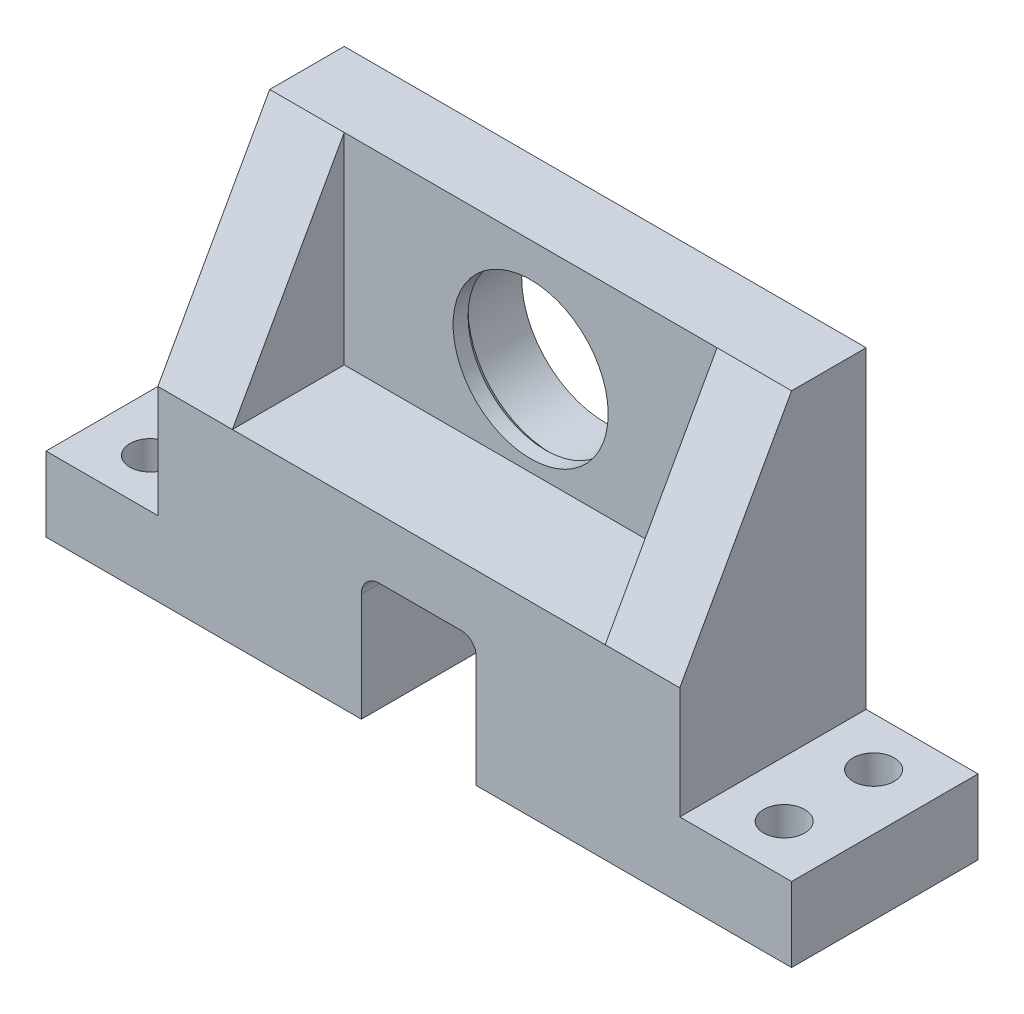
ISO-10303-21;
HEADER;
FILE_DESCRIPTION(('STEP AP214'),'2;1');
FILE_NAME('part.step','',(''),(''),'','','');
FILE_SCHEMA(('AUTOMOTIVE_DESIGN { 1 0 10303 214 1 1 1 1 }'));
ENDSEC;
DATA;
#1=APPLICATION_CONTEXT('core data for automotive mechanical design processes');
#2=APPLICATION_PROTOCOL_DEFINITION('international standard','automotive_design',2000,#1);
#3=PRODUCT_CONTEXT('',#1,'mechanical');
#4=PRODUCT('Part','Part','',(#3));
#5=PRODUCT_RELATED_PRODUCT_CATEGORY('part','',(#4));
#6=PRODUCT_DEFINITION_FORMATION('','',#4);
#7=PRODUCT_DEFINITION_CONTEXT('part definition',#1,'design');
#8=PRODUCT_DEFINITION('design','',#6,#7);
#9=PRODUCT_DEFINITION_SHAPE('','',#8);
#10=(LENGTH_UNIT() NAMED_UNIT(*) SI_UNIT(.MILLI.,.METRE.));
#11=(NAMED_UNIT(*) PLANE_ANGLE_UNIT() SI_UNIT($,.RADIAN.));
#12=(NAMED_UNIT(*) SI_UNIT($,.STERADIAN.) SOLID_ANGLE_UNIT());
#13=UNCERTAINTY_MEASURE_WITH_UNIT(LENGTH_MEASURE(1.E-05),#10,'distance_accuracy_value','');
#14=(GEOMETRIC_REPRESENTATION_CONTEXT(3) GLOBAL_UNCERTAINTY_ASSIGNED_CONTEXT((#13)) GLOBAL_UNIT_ASSIGNED_CONTEXT((#10,
#11,#12)) REPRESENTATION_CONTEXT('',''));
#15=CARTESIAN_POINT('',(0.,0.,0.));
#16=DIRECTION('',(0.,0.,1.));
#17=DIRECTION('',(1.,0.,0.));
#18=AXIS2_PLACEMENT_3D('',#15,#16,#17);
#19=CARTESIAN_POINT('',(0.,37.,25.));
#20=DIRECTION('',(0.,0.,-1.));
#21=DIRECTION('',(-1.,0.,0.));
#22=AXIS2_PLACEMENT_3D('',#19,#20,#21);
#23=CYLINDRICAL_SURFACE('',#22,11.2);
#24=CARTESIAN_POINT('',(0.,37.,7.20000000000002));
#25=DIRECTION('',(0.,0.,-1.));
#26=DIRECTION('',(-1.,0.,0.));
#27=AXIS2_PLACEMENT_3D('',#24,#25,#26);
#28=CIRCLE('',#27,11.2);
#29=CARTESIAN_POINT('',(-11.2,37.,7.20000000000002));
#30=VERTEX_POINT('',#29);
#31=EDGE_CURVE('E11',#30,#30,#28,.F.);
#32=ORIENTED_EDGE('',*,*,#31,.T.);
#33=EDGE_LOOP('',(#32));
#34=FACE_BOUND('',#33,.T.);
#35=CARTESIAN_POINT('',(0.,37.,0.));
#36=DIRECTION('',(0.,0.,-1.));
#37=DIRECTION('',(-1.,0.,0.));
#38=AXIS2_PLACEMENT_3D('',#35,#36,#37);
#39=CIRCLE('',#38,11.2);
#40=CARTESIAN_POINT('',(-11.2,37.,0.));
#41=VERTEX_POINT('',#40);
#42=EDGE_CURVE('E192',#41,#41,#39,.T.);
#43=ORIENTED_EDGE('',*,*,#42,.T.);
#44=EDGE_LOOP('',(#43));
#45=FACE_BOUND('',#44,.T.);
#46=ADVANCED_FACE('F39',(#34,#45),#23,.F.);
#47=CARTESIAN_POINT('',(-45.,25.,10.));
#48=DIRECTION('',(0.,-1.,0.));
#49=DIRECTION('',(0.,0.,-1.));
#50=AXIS2_PLACEMENT_3D('',#47,#48,#49);
#51=PLANE('',#50);
#52=DIRECTION('',(0.,0.,-1.));
#53=VECTOR('',#52,1.);
#54=CARTESIAN_POINT('',(25.,25.,10.));
#55=LINE('',#54,#53);
#56=CARTESIAN_POINT('',(25.,25.,25.));
#57=VERTEX_POINT('',#56);
#58=CARTESIAN_POINT('',(25.,25.,10.));
#59=VERTEX_POINT('',#58);
#60=EDGE_CURVE('E201',#57,#59,#55,.T.);
#61=ORIENTED_EDGE('',*,*,#60,.T.);
#62=DIRECTION('',(1.,0.,0.));
#63=VECTOR('',#62,1.);
#64=CARTESIAN_POINT('',(-45.,25.,10.));
#65=LINE('',#64,#63);
#66=CARTESIAN_POINT('',(-25.,25.,10.));
#67=VERTEX_POINT('',#66);
#68=EDGE_CURVE('E230',#67,#59,#65,.T.);
#69=ORIENTED_EDGE('',*,*,#68,.F.);
#70=DIRECTION('',(0.,0.,1.));
#71=VECTOR('',#70,1.);
#72=CARTESIAN_POINT('',(-25.,25.,10.));
#73=LINE('',#72,#71);
#74=CARTESIAN_POINT('',(-25.,25.,25.));
#75=VERTEX_POINT('',#74);
#76=EDGE_CURVE('E219',#67,#75,#73,.T.);
#77=ORIENTED_EDGE('',*,*,#76,.T.);
#78=DIRECTION('',(1.,0.,0.));
#79=VECTOR('',#78,1.);
#80=CARTESIAN_POINT('',(-45.,25.,25.));
#81=LINE('',#80,#79);
#82=EDGE_CURVE('E229',#75,#57,#81,.T.);
#83=ORIENTED_EDGE('',*,*,#82,.T.);
#84=EDGE_LOOP('',(#61,#69,#77,#83));
#85=FACE_BOUND('',#84,.T.);
#86=ADVANCED_FACE('F383',(#85),#51,.F.);
#87=CARTESIAN_POINT('',(0.,0.,10.));
#88=DIRECTION('',(0.,0.,1.));
#89=DIRECTION('',(1.,0.,0.));
#90=AXIS2_PLACEMENT_3D('',#87,#88,#89);
#91=PLANE('',#90);
#92=ORIENTED_EDGE('',*,*,#68,.T.);
#93=DIRECTION('',(0.,1.,0.));
#94=VECTOR('',#93,1.);
#95=CARTESIAN_POINT('',(25.,52.,10.));
#96=LINE('',#95,#94);
#97=CARTESIAN_POINT('',(25.,52.,10.));
#98=VERTEX_POINT('',#97);
#99=EDGE_CURVE('E63',#59,#98,#96,.T.);
#100=ORIENTED_EDGE('',*,*,#99,.T.);
#101=DIRECTION('',(-1.,0.,0.));
#102=VECTOR('',#101,1.);
#103=CARTESIAN_POINT('',(-35.,52.,10.));
#104=LINE('',#103,#102);
#105=CARTESIAN_POINT('',(-25.,52.,10.));
#106=VERTEX_POINT('',#105);
#107=EDGE_CURVE('E187',#98,#106,#104,.T.);
#108=ORIENTED_EDGE('',*,*,#107,.T.);
#109=DIRECTION('',(0.,-1.,0.));
#110=VECTOR('',#109,1.);
#111=CARTESIAN_POINT('',(-25.,52.,10.));
#112=LINE('',#111,#110);
#113=EDGE_CURVE('E216',#106,#67,#112,.T.);
#114=ORIENTED_EDGE('',*,*,#113,.T.);
#115=EDGE_LOOP('',(#92,#100,#108,#114));
#116=FACE_BOUND('',#115,.T.);
#117=CARTESIAN_POINT('',(0.,37.,10.));
#118=DIRECTION('',(0.,0.,1.));
#119=DIRECTION('',(1.,0.,0.));
#120=AXIS2_PLACEMENT_3D('',#117,#118,#119);
#121=CIRCLE('',#120,10.4);
#122=CARTESIAN_POINT('',(10.4,37.,10.));
#123=VERTEX_POINT('',#122);
#124=EDGE_CURVE('E197',#123,#123,#121,.T.);
#125=ORIENTED_EDGE('',*,*,#124,.F.);
#126=EDGE_LOOP('',(#125));
#127=FACE_BOUND('',#126,.T.);
#128=ADVANCED_FACE('F452',(#116,#127),#91,.T.);
#129=CARTESIAN_POINT('',(-35.,52.,25.));
#130=DIRECTION('',(0.,-1.,0.));
#131=DIRECTION('',(0.,0.,-1.));
#132=AXIS2_PLACEMENT_3D('',#129,#130,#131);
#133=PLANE('',#132);
#134=CARTESIAN_POINT('',(35.,52.,10.));
#135=VERTEX_POINT('',#134);
#136=EDGE_CURVE('E184',#135,#98,#104,.T.);
#137=ORIENTED_EDGE('',*,*,#136,.F.);
#138=DIRECTION('',(0.,0.,-1.));
#139=VECTOR('',#138,1.);
#140=CARTESIAN_POINT('',(35.,52.,25.));
#141=LINE('',#140,#139);
#142=CARTESIAN_POINT('',(35.,52.,0.));
#143=VERTEX_POINT('',#142);
#144=EDGE_CURVE('E167',#135,#143,#141,.T.);
#145=ORIENTED_EDGE('',*,*,#144,.T.);
#146=DIRECTION('',(-1.,0.,0.));
#147=VECTOR('',#146,1.);
#148=CARTESIAN_POINT('',(-35.,52.,0.));
#149=LINE('',#148,#147);
#150=CARTESIAN_POINT('',(-35.,52.,0.));
#151=VERTEX_POINT('',#150);
#152=EDGE_CURVE('E294',#143,#151,#149,.T.);
#153=ORIENTED_EDGE('',*,*,#152,.T.);
#154=DIRECTION('',(0.,0.,-1.));
#155=VECTOR('',#154,1.);
#156=CARTESIAN_POINT('',(-35.,52.,25.));
#157=LINE('',#156,#155);
#158=CARTESIAN_POINT('',(-35.,52.,10.));
#159=VERTEX_POINT('',#158);
#160=EDGE_CURVE('E181',#159,#151,#157,.T.);
#161=ORIENTED_EDGE('',*,*,#160,.F.);
#162=DIRECTION('',(-1.,0.,0.));
#163=VECTOR('',#162,1.);
#164=CARTESIAN_POINT('',(-25.,52.,10.));
#165=LINE('',#164,#163);
#166=EDGE_CURVE('E222',#106,#159,#165,.T.);
#167=ORIENTED_EDGE('',*,*,#166,.F.);
#168=ORIENTED_EDGE('',*,*,#107,.F.);
#169=EDGE_LOOP('',(#137,#145,#153,#161,#167,#168));
#170=FACE_BOUND('',#169,.T.);
#171=ADVANCED_FACE('F185',(#170),#133,.F.);
#172=CARTESIAN_POINT('',(7.7,0.,25.));
#173=DIRECTION('',(0.,1.,0.));
#174=DIRECTION('',(-1.,0.,0.));
#175=AXIS2_PLACEMENT_3D('',#172,#173,#174);
#176=PLANE('',#175);
#177=CARTESIAN_POINT('',(42.5,0.,18.5));
#178=DIRECTION('',(0.,1.,0.));
#179=DIRECTION('',(-1.,0.,0.));
#180=AXIS2_PLACEMENT_3D('',#177,#178,#179);
#181=CIRCLE('',#180,2.74999999999999);
#182=CARTESIAN_POINT('',(39.75,0.,18.5));
#183=VERTEX_POINT('',#182);
#184=EDGE_CURVE('E483',#183,#183,#181,.T.);
#185=ORIENTED_EDGE('',*,*,#184,.T.);
#186=EDGE_LOOP('',(#185));
#187=FACE_BOUND('',#186,.T.);
#188=CARTESIAN_POINT('',(42.5,0.,6.5));
#189=DIRECTION('',(0.,1.,0.));
#190=DIRECTION('',(-1.,0.,0.));
#191=AXIS2_PLACEMENT_3D('',#188,#189,#190);
#192=CIRCLE('',#191,2.74999999999999);
#193=CARTESIAN_POINT('',(39.75,0.,6.5));
#194=VERTEX_POINT('',#193);
#195=EDGE_CURVE('E475',#194,#194,#192,.T.);
#196=ORIENTED_EDGE('',*,*,#195,.T.);
#197=EDGE_LOOP('',(#196));
#198=FACE_BOUND('',#197,.T.);
#199=DIRECTION('',(1.,0.,0.));
#200=VECTOR('',#199,1.);
#201=CARTESIAN_POINT('',(7.7,0.,0.));
#202=LINE('',#201,#200);
#203=CARTESIAN_POINT('',(7.7,0.,0.));
#204=VERTEX_POINT('',#203);
#205=CARTESIAN_POINT('',(50.,0.,0.));
#206=VERTEX_POINT('',#205);
#207=EDGE_CURVE('E240',#204,#206,#202,.T.);
#208=ORIENTED_EDGE('',*,*,#207,.T.);
#209=DIRECTION('',(0.,0.,-1.));
#210=VECTOR('',#209,1.);
#211=CARTESIAN_POINT('',(50.,0.,25.));
#212=LINE('',#211,#210);
#213=CARTESIAN_POINT('',(50.,0.,25.));
#214=VERTEX_POINT('',#213);
#215=EDGE_CURVE('E366',#214,#206,#212,.T.);
#216=ORIENTED_EDGE('',*,*,#215,.F.);
#217=DIRECTION('',(1.,0.,0.));
#218=VECTOR('',#217,1.);
#219=CARTESIAN_POINT('',(7.7,0.,25.));
#220=LINE('',#219,#218);
#221=CARTESIAN_POINT('',(7.7,0.,25.));
#222=VERTEX_POINT('',#221);
#223=EDGE_CURVE('E241',#222,#214,#220,.T.);
#224=ORIENTED_EDGE('',*,*,#223,.F.);
#225=DIRECTION('',(0.,0.,-1.));
#226=VECTOR('',#225,1.);
#227=CARTESIAN_POINT('',(7.7,0.,25.));
#228=LINE('',#227,#226);
#229=EDGE_CURVE('E282',#222,#204,#228,.T.);
#230=ORIENTED_EDGE('',*,*,#229,.T.);
#231=EDGE_LOOP('',(#208,#216,#224,#230));
#232=FACE_BOUND('',#231,.T.);
#233=ADVANCED_FACE('F399',(#187,#198,#232),#176,.F.);
#234=CARTESIAN_POINT('',(50.,0.,25.));
#235=DIRECTION('',(-1.,0.,0.));
#236=DIRECTION('',(0.,0.,1.));
#237=AXIS2_PLACEMENT_3D('',#234,#235,#236);
#238=PLANE('',#237);
#239=DIRECTION('',(0.,1.,0.));
#240=VECTOR('',#239,1.);
#241=CARTESIAN_POINT('',(50.,0.,0.));
#242=LINE('',#241,#240);
#243=CARTESIAN_POINT('',(50.,10.,0.));
#244=VERTEX_POINT('',#243);
#245=EDGE_CURVE('E286',#206,#244,#242,.T.);
#246=ORIENTED_EDGE('',*,*,#245,.T.);
#247=DIRECTION('',(0.,0.,-1.));
#248=VECTOR('',#247,1.);
#249=CARTESIAN_POINT('',(50.,10.,25.));
#250=LINE('',#249,#248);
#251=CARTESIAN_POINT('',(50.,10.,25.));
#252=VERTEX_POINT('',#251);
#253=EDGE_CURVE('E362',#252,#244,#250,.T.);
#254=ORIENTED_EDGE('',*,*,#253,.F.);
#255=DIRECTION('',(0.,1.,0.));
#256=VECTOR('',#255,1.);
#257=CARTESIAN_POINT('',(50.,0.,25.));
#258=LINE('',#257,#256);
#259=EDGE_CURVE('E245',#214,#252,#258,.T.);
#260=ORIENTED_EDGE('',*,*,#259,.F.);
#261=ORIENTED_EDGE('',*,*,#215,.T.);
#262=EDGE_LOOP('',(#246,#254,#260,#261));
#263=FACE_BOUND('',#262,.T.);
#264=ADVANCED_FACE('F497',(#263),#238,.F.);
#265=CARTESIAN_POINT('',(50.,10.,25.));
#266=DIRECTION('',(0.,-1.,0.));
#267=DIRECTION('',(1.,0.,0.));
#268=AXIS2_PLACEMENT_3D('',#265,#266,#267);
#269=PLANE('',#268);
#270=CARTESIAN_POINT('',(42.5,10.,18.5));
#271=DIRECTION('',(0.,1.,0.));
#272=DIRECTION('',(0.,0.,1.));
#273=AXIS2_PLACEMENT_3D('',#270,#271,#272);
#274=CIRCLE('',#273,2.74999999999999);
#275=CARTESIAN_POINT('',(42.5,10.,21.25));
#276=VERTEX_POINT('',#275);
#277=EDGE_CURVE('E487',#276,#276,#274,.T.);
#278=ORIENTED_EDGE('',*,*,#277,.F.);
#279=EDGE_LOOP('',(#278));
#280=FACE_BOUND('',#279,.T.);
#281=CARTESIAN_POINT('',(42.5,10.,6.5));
#282=DIRECTION('',(0.,1.,0.));
#283=DIRECTION('',(0.,0.,1.));
#284=AXIS2_PLACEMENT_3D('',#281,#282,#283);
#285=CIRCLE('',#284,2.74999999999999);
#286=CARTESIAN_POINT('',(42.5,10.,9.24999999999999));
#287=VERTEX_POINT('',#286);
#288=EDGE_CURVE('E479',#287,#287,#285,.T.);
#289=ORIENTED_EDGE('',*,*,#288,.F.);
#290=EDGE_LOOP('',(#289));
#291=FACE_BOUND('',#290,.T.);
#292=DIRECTION('',(-1.,0.,0.));
#293=VECTOR('',#292,1.);
#294=CARTESIAN_POINT('',(50.,10.,0.));
#295=LINE('',#294,#293);
#296=CARTESIAN_POINT('',(35.,10.,0.));
#297=VERTEX_POINT('',#296);
#298=EDGE_CURVE('E289',#244,#297,#295,.T.);
#299=ORIENTED_EDGE('',*,*,#298,.T.);
#300=DIRECTION('',(0.,0.,-1.));
#301=VECTOR('',#300,1.);
#302=CARTESIAN_POINT('',(35.,10.,25.));
#303=LINE('',#302,#301);
#304=CARTESIAN_POINT('',(35.,10.,25.));
#305=VERTEX_POINT('',#304);
#306=EDGE_CURVE('E180',#305,#297,#303,.T.);
#307=ORIENTED_EDGE('',*,*,#306,.F.);
#308=DIRECTION('',(-1.,0.,0.));
#309=VECTOR('',#308,1.);
#310=CARTESIAN_POINT('',(50.,10.,25.));
#311=LINE('',#310,#309);
#312=EDGE_CURVE('E249',#252,#305,#311,.T.);
#313=ORIENTED_EDGE('',*,*,#312,.F.);
#314=ORIENTED_EDGE('',*,*,#253,.T.);
#315=EDGE_LOOP('',(#299,#307,#313,#314));
#316=FACE_BOUND('',#315,.T.);
#317=ADVANCED_FACE('F494',(#280,#291,#316),#269,.F.);
#318=CARTESIAN_POINT('',(35.,52.,25.));
#319=DIRECTION('',(-1.,0.,0.));
#320=DIRECTION('',(0.,0.,1.));
#321=AXIS2_PLACEMENT_3D('',#318,#319,#320);
#322=PLANE('',#321);
#323=DIRECTION('',(0.,-0.874157276121538,0.485642931178632));
#324=VECTOR('',#323,1.);
#325=CARTESIAN_POINT('',(35.,25.,25.));
#326=LINE('',#325,#324);
#327=CARTESIAN_POINT('',(35.,25.,25.));
#328=VERTEX_POINT('',#327);
#329=EDGE_CURVE('E172',#135,#328,#326,.T.);
#330=ORIENTED_EDGE('',*,*,#329,.T.);
#331=DIRECTION('',(0.,1.,0.));
#332=VECTOR('',#331,1.);
#333=CARTESIAN_POINT('',(35.,52.,25.));
#334=LINE('',#333,#332);
#335=EDGE_CURVE('E252',#305,#328,#334,.T.);
#336=ORIENTED_EDGE('',*,*,#335,.F.);
#337=ORIENTED_EDGE('',*,*,#306,.T.);
#338=DIRECTION('',(0.,1.,0.));
#339=VECTOR('',#338,1.);
#340=CARTESIAN_POINT('',(35.,52.,0.));
#341=LINE('',#340,#339);
#342=EDGE_CURVE('E175',#297,#143,#341,.T.);
#343=ORIENTED_EDGE('',*,*,#342,.T.);
#344=ORIENTED_EDGE('',*,*,#144,.F.);
#345=EDGE_LOOP('',(#330,#336,#337,#343,#344));
#346=FACE_BOUND('',#345,.T.);
#347=ADVANCED_FACE('F169',(#346),#322,.F.);
#348=CARTESIAN_POINT('',(-35.,10.,25.));
#349=DIRECTION('',(1.,0.,0.));
#350=DIRECTION('',(0.,0.,-1.));
#351=AXIS2_PLACEMENT_3D('',#348,#349,#350);
#352=PLANE('',#351);
#353=DIRECTION('',(0.,-1.,0.));
#354=VECTOR('',#353,1.);
#355=CARTESIAN_POINT('',(-35.,10.,25.));
#356=LINE('',#355,#354);
#357=CARTESIAN_POINT('',(-35.,25.,25.));
#358=VERTEX_POINT('',#357);
#359=CARTESIAN_POINT('',(-35.,10.,25.));
#360=VERTEX_POINT('',#359);
#361=EDGE_CURVE('E255',#358,#360,#356,.T.);
#362=ORIENTED_EDGE('',*,*,#361,.F.);
#363=DIRECTION('',(0.,0.874157276121538,-0.485642931178632));
#364=VECTOR('',#363,1.);
#365=CARTESIAN_POINT('',(-35.,25.,25.));
#366=LINE('',#365,#364);
#367=EDGE_CURVE('E211',#358,#159,#366,.T.);
#368=ORIENTED_EDGE('',*,*,#367,.T.);
#369=ORIENTED_EDGE('',*,*,#160,.T.);
#370=DIRECTION('',(0.,-1.,0.));
#371=VECTOR('',#370,1.);
#372=CARTESIAN_POINT('',(-35.,10.,0.));
#373=LINE('',#372,#371);
#374=CARTESIAN_POINT('',(-35.,10.,0.));
#375=VERTEX_POINT('',#374);
#376=EDGE_CURVE('E297',#151,#375,#373,.T.);
#377=ORIENTED_EDGE('',*,*,#376,.T.);
#378=DIRECTION('',(0.,0.,-1.));
#379=VECTOR('',#378,1.);
#380=CARTESIAN_POINT('',(-35.,10.,25.));
#381=LINE('',#380,#379);
#382=EDGE_CURVE('E354',#360,#375,#381,.T.);
#383=ORIENTED_EDGE('',*,*,#382,.F.);
#384=EDGE_LOOP('',(#362,#368,#369,#377,#383));
#385=FACE_BOUND('',#384,.T.);
#386=ADVANCED_FACE('F443',(#385),#352,.F.);
#387=CARTESIAN_POINT('',(-50.,10.,25.));
#388=DIRECTION('',(0.,-1.,0.));
#389=DIRECTION('',(1.,0.,0.));
#390=AXIS2_PLACEMENT_3D('',#387,#388,#389);
#391=PLANE('',#390);
#392=CARTESIAN_POINT('',(-42.5,9.99999999999999,18.5));
#393=DIRECTION('',(0.,1.,0.));
#394=DIRECTION('',(0.,0.,1.));
#395=AXIS2_PLACEMENT_3D('',#392,#393,#394);
#396=CIRCLE('',#395,2.74999999999999);
#397=CARTESIAN_POINT('',(-42.5,9.99999999999999,21.25));
#398=VERTEX_POINT('',#397);
#399=EDGE_CURVE('E471',#398,#398,#396,.T.);
#400=ORIENTED_EDGE('',*,*,#399,.F.);
#401=EDGE_LOOP('',(#400));
#402=FACE_BOUND('',#401,.T.);
#403=CARTESIAN_POINT('',(-42.5,9.99999999999999,6.5));
#404=DIRECTION('',(0.,1.,0.));
#405=DIRECTION('',(0.,0.,1.));
#406=AXIS2_PLACEMENT_3D('',#403,#404,#405);
#407=CIRCLE('',#406,2.74999999999999);
#408=CARTESIAN_POINT('',(-42.5,9.99999999999999,9.24999999999999));
#409=VERTEX_POINT('',#408);
#410=EDGE_CURVE('E463',#409,#409,#407,.T.);
#411=ORIENTED_EDGE('',*,*,#410,.F.);
#412=EDGE_LOOP('',(#411));
#413=FACE_BOUND('',#412,.T.);
#414=DIRECTION('',(-1.,0.,0.));
#415=VECTOR('',#414,1.);
#416=CARTESIAN_POINT('',(-50.,10.,0.));
#417=LINE('',#416,#415);
#418=CARTESIAN_POINT('',(-50.,10.,0.));
#419=VERTEX_POINT('',#418);
#420=EDGE_CURVE('E300',#375,#419,#417,.T.);
#421=ORIENTED_EDGE('',*,*,#420,.T.);
#422=DIRECTION('',(0.,0.,-1.));
#423=VECTOR('',#422,1.);
#424=CARTESIAN_POINT('',(-50.,10.,25.));
#425=LINE('',#424,#423);
#426=CARTESIAN_POINT('',(-50.,10.,25.));
#427=VERTEX_POINT('',#426);
#428=EDGE_CURVE('E350',#427,#419,#425,.T.);
#429=ORIENTED_EDGE('',*,*,#428,.F.);
#430=DIRECTION('',(-1.,0.,0.));
#431=VECTOR('',#430,1.);
#432=CARTESIAN_POINT('',(-50.,10.,25.));
#433=LINE('',#432,#431);
#434=EDGE_CURVE('E258',#360,#427,#433,.T.);
#435=ORIENTED_EDGE('',*,*,#434,.F.);
#436=ORIENTED_EDGE('',*,*,#382,.T.);
#437=EDGE_LOOP('',(#421,#429,#435,#436));
#438=FACE_BOUND('',#437,.T.);
#439=ADVANCED_FACE('F438',(#402,#413,#438),#391,.F.);
#440=CARTESIAN_POINT('',(-50.,0.,25.));
#441=DIRECTION('',(1.,0.,0.));
#442=DIRECTION('',(0.,0.,-1.));
#443=AXIS2_PLACEMENT_3D('',#440,#441,#442);
#444=PLANE('',#443);
#445=DIRECTION('',(0.,-1.,0.));
#446=VECTOR('',#445,1.);
#447=CARTESIAN_POINT('',(-50.,0.,0.));
#448=LINE('',#447,#446);
#449=CARTESIAN_POINT('',(-50.,0.,0.));
#450=VERTEX_POINT('',#449);
#451=EDGE_CURVE('E303',#419,#450,#448,.T.);
#452=ORIENTED_EDGE('',*,*,#451,.T.);
#453=DIRECTION('',(0.,0.,-1.));
#454=VECTOR('',#453,1.);
#455=CARTESIAN_POINT('',(-50.,0.,25.));
#456=LINE('',#455,#454);
#457=CARTESIAN_POINT('',(-50.,0.,25.));
#458=VERTEX_POINT('',#457);
#459=EDGE_CURVE('E346',#458,#450,#456,.T.);
#460=ORIENTED_EDGE('',*,*,#459,.F.);
#461=DIRECTION('',(0.,-1.,0.));
#462=VECTOR('',#461,1.);
#463=CARTESIAN_POINT('',(-50.,0.,25.));
#464=LINE('',#463,#462);
#465=EDGE_CURVE('E261',#427,#458,#464,.T.);
#466=ORIENTED_EDGE('',*,*,#465,.F.);
#467=ORIENTED_EDGE('',*,*,#428,.T.);
#468=EDGE_LOOP('',(#452,#460,#466,#467));
#469=FACE_BOUND('',#468,.T.);
#470=ADVANCED_FACE('F434',(#469),#444,.F.);
#471=CARTESIAN_POINT('',(-7.7,0.,25.));
#472=DIRECTION('',(0.,1.,0.));
#473=DIRECTION('',(-1.,0.,0.));
#474=AXIS2_PLACEMENT_3D('',#471,#472,#473);
#475=PLANE('',#474);
#476=CARTESIAN_POINT('',(-42.5,0.,18.5));
#477=DIRECTION('',(0.,1.,0.));
#478=DIRECTION('',(-1.,0.,0.));
#479=AXIS2_PLACEMENT_3D('',#476,#477,#478);
#480=CIRCLE('',#479,2.74999999999999);
#481=CARTESIAN_POINT('',(-45.25,0.,18.5));
#482=VERTEX_POINT('',#481);
#483=EDGE_CURVE('E467',#482,#482,#480,.T.);
#484=ORIENTED_EDGE('',*,*,#483,.T.);
#485=EDGE_LOOP('',(#484));
#486=FACE_BOUND('',#485,.T.);
#487=CARTESIAN_POINT('',(-42.5,0.,6.5));
#488=DIRECTION('',(0.,1.,0.));
#489=DIRECTION('',(-1.,0.,0.));
#490=AXIS2_PLACEMENT_3D('',#487,#488,#489);
#491=CIRCLE('',#490,2.74999999999999);
#492=CARTESIAN_POINT('',(-45.25,0.,6.5));
#493=VERTEX_POINT('',#492);
#494=EDGE_CURVE('E204',#493,#493,#491,.T.);
#495=ORIENTED_EDGE('',*,*,#494,.T.);
#496=EDGE_LOOP('',(#495));
#497=FACE_BOUND('',#496,.T.);
#498=DIRECTION('',(1.,0.,0.));
#499=VECTOR('',#498,1.);
#500=CARTESIAN_POINT('',(-7.7,0.,0.));
#501=LINE('',#500,#499);
#502=CARTESIAN_POINT('',(-7.7,0.,0.));
#503=VERTEX_POINT('',#502);
#504=EDGE_CURVE('E306',#450,#503,#501,.T.);
#505=ORIENTED_EDGE('',*,*,#504,.T.);
#506=DIRECTION('',(0.,0.,-1.));
#507=VECTOR('',#506,1.);
#508=CARTESIAN_POINT('',(-7.7,0.,25.));
#509=LINE('',#508,#507);
#510=CARTESIAN_POINT('',(-7.7,0.,25.));
#511=VERTEX_POINT('',#510);
#512=EDGE_CURVE('E342',#511,#503,#509,.T.);
#513=ORIENTED_EDGE('',*,*,#512,.F.);
#514=DIRECTION('',(1.,0.,0.));
#515=VECTOR('',#514,1.);
#516=CARTESIAN_POINT('',(-7.7,0.,25.));
#517=LINE('',#516,#515);
#518=EDGE_CURVE('E264',#458,#511,#517,.T.);
#519=ORIENTED_EDGE('',*,*,#518,.F.);
#520=ORIENTED_EDGE('',*,*,#459,.T.);
#521=EDGE_LOOP('',(#505,#513,#519,#520));
#522=FACE_BOUND('',#521,.T.);
#523=ADVANCED_FACE('F429',(#486,#497,#522),#475,.F.);
#524=CARTESIAN_POINT('',(-7.7,0.,25.));
#525=DIRECTION('',(-1.,0.,0.));
#526=DIRECTION('',(0.,0.,1.));
#527=AXIS2_PLACEMENT_3D('',#524,#525,#526);
#528=PLANE('',#527);
#529=DIRECTION('',(0.,1.,0.));
#530=VECTOR('',#529,1.);
#531=CARTESIAN_POINT('',(-7.7,0.,0.));
#532=LINE('',#531,#530);
#533=CARTESIAN_POINT('',(-7.7,14.5600933282117,0.));
#534=VERTEX_POINT('',#533);
#535=EDGE_CURVE('E309',#503,#534,#532,.T.);
#536=ORIENTED_EDGE('',*,*,#535,.T.);
#537=DIRECTION('',(0.,0.,-1.));
#538=VECTOR('',#537,1.);
#539=CARTESIAN_POINT('',(-7.7,14.5600933282117,25.));
#540=LINE('',#539,#538);
#541=CARTESIAN_POINT('',(-7.7,14.5600933282117,25.));
#542=VERTEX_POINT('',#541);
#543=EDGE_CURVE('E338',#542,#534,#540,.T.);
#544=ORIENTED_EDGE('',*,*,#543,.F.);
#545=DIRECTION('',(0.,1.,0.));
#546=VECTOR('',#545,1.);
#547=CARTESIAN_POINT('',(-7.7,0.,25.));
#548=LINE('',#547,#546);
#549=EDGE_CURVE('E267',#511,#542,#548,.T.);
#550=ORIENTED_EDGE('',*,*,#549,.F.);
#551=ORIENTED_EDGE('',*,*,#512,.T.);
#552=EDGE_LOOP('',(#536,#544,#550,#551));
#553=FACE_BOUND('',#552,.T.);
#554=ADVANCED_FACE('F423',(#553),#528,.F.);
#555=CARTESIAN_POINT('',(-5.26009332821174,14.5600933282117,25.));
#556=DIRECTION('',(0.,0.,-1.));
#557=DIRECTION('',(-1.,0.,0.));
#558=AXIS2_PLACEMENT_3D('',#555,#556,#557);
#559=CYLINDRICAL_SURFACE('',#558,2.43990667178826);
#560=CARTESIAN_POINT('',(-5.26009332821174,14.5600933282117,0.));
#561=DIRECTION('',(0.,0.,-1.));
#562=DIRECTION('',(-1.,0.,0.));
#563=AXIS2_PLACEMENT_3D('',#560,#561,#562);
#564=CIRCLE('',#563,2.43990667178826);
#565=CARTESIAN_POINT('',(-5.26009332821174,17.,0.));
#566=VERTEX_POINT('',#565);
#567=EDGE_CURVE('E312',#534,#566,#564,.T.);
#568=ORIENTED_EDGE('',*,*,#567,.T.);
#569=DIRECTION('',(0.,0.,-1.));
#570=VECTOR('',#569,1.);
#571=CARTESIAN_POINT('',(-5.26009332821174,17.,25.));
#572=LINE('',#571,#570);
#573=CARTESIAN_POINT('',(-5.26009332821174,17.,25.));
#574=VERTEX_POINT('',#573);
#575=EDGE_CURVE('E334',#574,#566,#572,.T.);
#576=ORIENTED_EDGE('',*,*,#575,.F.);
#577=CARTESIAN_POINT('',(-5.26009332821174,14.5600933282117,25.));
#578=DIRECTION('',(0.,0.,-1.));
#579=DIRECTION('',(-1.,0.,0.));
#580=AXIS2_PLACEMENT_3D('',#577,#578,#579);
#581=CIRCLE('',#580,2.43990667178826);
#582=EDGE_CURVE('E270',#542,#574,#581,.T.);
#583=ORIENTED_EDGE('',*,*,#582,.F.);
#584=ORIENTED_EDGE('',*,*,#543,.T.);
#585=EDGE_LOOP('',(#568,#576,#583,#584));
#586=FACE_BOUND('',#585,.T.);
#587=ADVANCED_FACE('F419',(#586),#559,.F.);
#588=CARTESIAN_POINT('',(5.7,17.,25.));
#589=DIRECTION('',(0.,1.,0.));
#590=DIRECTION('',(0.,0.,1.));
#591=AXIS2_PLACEMENT_3D('',#588,#589,#590);
#592=PLANE('',#591);
#593=DIRECTION('',(1.,0.,0.));
#594=VECTOR('',#593,1.);
#595=CARTESIAN_POINT('',(5.7,17.,0.));
#596=LINE('',#595,#594);
#597=CARTESIAN_POINT('',(5.7,17.,0.));
#598=VERTEX_POINT('',#597);
#599=EDGE_CURVE('E315',#566,#598,#596,.T.);
#600=ORIENTED_EDGE('',*,*,#599,.T.);
#601=DIRECTION('',(0.,0.,-1.));
#602=VECTOR('',#601,1.);
#603=CARTESIAN_POINT('',(5.7,17.,25.));
#604=LINE('',#603,#602);
#605=CARTESIAN_POINT('',(5.7,17.,25.));
#606=VERTEX_POINT('',#605);
#607=EDGE_CURVE('E330',#606,#598,#604,.T.);
#608=ORIENTED_EDGE('',*,*,#607,.F.);
#609=DIRECTION('',(1.,0.,0.));
#610=VECTOR('',#609,1.);
#611=CARTESIAN_POINT('',(5.7,17.,25.));
#612=LINE('',#611,#610);
#613=EDGE_CURVE('E273',#574,#606,#612,.T.);
#614=ORIENTED_EDGE('',*,*,#613,.F.);
#615=ORIENTED_EDGE('',*,*,#575,.T.);
#616=EDGE_LOOP('',(#600,#608,#614,#615));
#617=FACE_BOUND('',#616,.T.);
#618=ADVANCED_FACE('F414',(#617),#592,.F.);
#619=CARTESIAN_POINT('',(5.7,15.,25.));
#620=DIRECTION('',(0.,0.,-1.));
#621=DIRECTION('',(-1.,0.,0.));
#622=AXIS2_PLACEMENT_3D('',#619,#620,#621);
#623=CYLINDRICAL_SURFACE('',#622,2.);
#624=CARTESIAN_POINT('',(5.7,15.,0.));
#625=DIRECTION('',(0.,0.,-1.));
#626=DIRECTION('',(1.,0.,0.));
#627=AXIS2_PLACEMENT_3D('',#624,#625,#626);
#628=CIRCLE('',#627,2.);
#629=CARTESIAN_POINT('',(7.7,15.,0.));
#630=VERTEX_POINT('',#629);
#631=EDGE_CURVE('E318',#598,#630,#628,.T.);
#632=ORIENTED_EDGE('',*,*,#631,.T.);
#633=DIRECTION('',(0.,0.,-1.));
#634=VECTOR('',#633,1.);
#635=CARTESIAN_POINT('',(7.7,15.,25.));
#636=LINE('',#635,#634);
#637=CARTESIAN_POINT('',(7.7,15.,25.));
#638=VERTEX_POINT('',#637);
#639=EDGE_CURVE('E326',#638,#630,#636,.T.);
#640=ORIENTED_EDGE('',*,*,#639,.F.);
#641=CARTESIAN_POINT('',(5.7,15.,25.));
#642=DIRECTION('',(0.,0.,-1.));
#643=DIRECTION('',(1.,0.,0.));
#644=AXIS2_PLACEMENT_3D('',#641,#642,#643);
#645=CIRCLE('',#644,2.);
#646=EDGE_CURVE('E276',#606,#638,#645,.T.);
#647=ORIENTED_EDGE('',*,*,#646,.F.);
#648=ORIENTED_EDGE('',*,*,#607,.T.);
#649=EDGE_LOOP('',(#632,#640,#647,#648));
#650=FACE_BOUND('',#649,.T.);
#651=ADVANCED_FACE('F408',(#650),#623,.F.);
#652=CARTESIAN_POINT('',(7.7,0.,25.));
#653=DIRECTION('',(1.,0.,0.));
#654=DIRECTION('',(0.,0.,-1.));
#655=AXIS2_PLACEMENT_3D('',#652,#653,#654);
#656=PLANE('',#655);
#657=DIRECTION('',(0.,-1.,0.));
#658=VECTOR('',#657,1.);
#659=CARTESIAN_POINT('',(7.7,0.,0.));
#660=LINE('',#659,#658);
#661=EDGE_CURVE('E246',#630,#204,#660,.T.);
#662=ORIENTED_EDGE('',*,*,#661,.T.);
#663=ORIENTED_EDGE('',*,*,#229,.F.);
#664=DIRECTION('',(0.,-1.,0.));
#665=VECTOR('',#664,1.);
#666=CARTESIAN_POINT('',(7.7,0.,25.));
#667=LINE('',#666,#665);
#668=EDGE_CURVE('E279',#638,#222,#667,.T.);
#669=ORIENTED_EDGE('',*,*,#668,.F.);
#670=ORIENTED_EDGE('',*,*,#639,.T.);
#671=EDGE_LOOP('',(#662,#663,#669,#670));
#672=FACE_BOUND('',#671,.T.);
#673=ADVANCED_FACE('F404',(#672),#656,.F.);
#674=CARTESIAN_POINT('',(-5.26009332821174,14.5600933282117,25.));
#675=DIRECTION('',(0.,0.,-1.));
#676=DIRECTION('',(-1.,0.,0.));
#677=AXIS2_PLACEMENT_3D('',#674,#675,#676);
#678=PLANE('',#677);
#679=ORIENTED_EDGE('',*,*,#335,.T.);
#680=DIRECTION('',(1.,0.,0.));
#681=VECTOR('',#680,1.);
#682=CARTESIAN_POINT('',(25.,25.,25.));
#683=LINE('',#682,#681);
#684=EDGE_CURVE('E55',#57,#328,#683,.T.);
#685=ORIENTED_EDGE('',*,*,#684,.F.);
#686=ORIENTED_EDGE('',*,*,#82,.F.);
#687=EDGE_CURVE('E233',#358,#75,#81,.T.);
#688=ORIENTED_EDGE('',*,*,#687,.F.);
#689=ORIENTED_EDGE('',*,*,#361,.T.);
#690=ORIENTED_EDGE('',*,*,#434,.T.);
#691=ORIENTED_EDGE('',*,*,#465,.T.);
#692=ORIENTED_EDGE('',*,*,#518,.T.);
#693=ORIENTED_EDGE('',*,*,#549,.T.);
#694=ORIENTED_EDGE('',*,*,#582,.T.);
#695=ORIENTED_EDGE('',*,*,#613,.T.);
#696=ORIENTED_EDGE('',*,*,#646,.T.);
#697=ORIENTED_EDGE('',*,*,#668,.T.);
#698=ORIENTED_EDGE('',*,*,#223,.T.);
#699=ORIENTED_EDGE('',*,*,#259,.T.);
#700=ORIENTED_EDGE('',*,*,#312,.T.);
#701=EDGE_LOOP('',(#679,#685,#686,#688,#689,#690,#691,#692,#693,#694,#695,#696,#697,#698,#699,#700));
#702=FACE_BOUND('',#701,.T.);
#703=ADVANCED_FACE('F391',(#702),#678,.F.);
#704=CARTESIAN_POINT('',(-5.26009332821174,14.5600933282117,0.));
#705=DIRECTION('',(0.,0.,-1.));
#706=DIRECTION('',(-1.,0.,0.));
#707=AXIS2_PLACEMENT_3D('',#704,#705,#706);
#708=PLANE('',#707);
#709=ORIENTED_EDGE('',*,*,#42,.F.);
#710=EDGE_LOOP('',(#709));
#711=FACE_BOUND('',#710,.T.);
#712=ORIENTED_EDGE('',*,*,#207,.F.);
#713=ORIENTED_EDGE('',*,*,#661,.F.);
#714=ORIENTED_EDGE('',*,*,#631,.F.);
#715=ORIENTED_EDGE('',*,*,#599,.F.);
#716=ORIENTED_EDGE('',*,*,#567,.F.);
#717=ORIENTED_EDGE('',*,*,#535,.F.);
#718=ORIENTED_EDGE('',*,*,#504,.F.);
#719=ORIENTED_EDGE('',*,*,#451,.F.);
#720=ORIENTED_EDGE('',*,*,#420,.F.);
#721=ORIENTED_EDGE('',*,*,#376,.F.);
#722=ORIENTED_EDGE('',*,*,#152,.F.);
#723=ORIENTED_EDGE('',*,*,#342,.F.);
#724=ORIENTED_EDGE('',*,*,#298,.F.);
#725=ORIENTED_EDGE('',*,*,#245,.F.);
#726=EDGE_LOOP('',(#712,#713,#714,#715,#716,#717,#718,#719,#720,#721,#722,#723,#724,#725));
#727=FACE_BOUND('',#726,.T.);
#728=ADVANCED_FACE('F387',(#711,#727),#708,.T.);
#729=CARTESIAN_POINT('',(-25.,25.,25.));
#730=DIRECTION('',(0.,0.485642931178632,0.874157276121538));
#731=DIRECTION('',(0.,-0.874157276121538,0.485642931178632));
#732=AXIS2_PLACEMENT_3D('',#729,#730,#731);
#733=PLANE('',#732);
#734=ORIENTED_EDGE('',*,*,#367,.F.);
#735=ORIENTED_EDGE('',*,*,#687,.T.);
#736=DIRECTION('',(0.,0.874157276121538,-0.485642931178632));
#737=VECTOR('',#736,1.);
#738=CARTESIAN_POINT('',(-25.,25.,25.));
#739=LINE('',#738,#737);
#740=EDGE_CURVE('E212',#75,#106,#739,.T.);
#741=ORIENTED_EDGE('',*,*,#740,.T.);
#742=ORIENTED_EDGE('',*,*,#166,.T.);
#743=EDGE_LOOP('',(#734,#735,#741,#742));
#744=FACE_BOUND('',#743,.T.);
#745=ADVANCED_FACE('F390',(#744),#733,.T.);
#746=CARTESIAN_POINT('',(-25.,0.,0.));
#747=DIRECTION('',(1.,0.,0.));
#748=DIRECTION('',(0.,0.,-1.));
#749=AXIS2_PLACEMENT_3D('',#746,#747,#748);
#750=PLANE('',#749);
#751=ORIENTED_EDGE('',*,*,#740,.F.);
#752=ORIENTED_EDGE('',*,*,#76,.F.);
#753=ORIENTED_EDGE('',*,*,#113,.F.);
#754=EDGE_LOOP('',(#751,#752,#753));
#755=FACE_BOUND('',#754,.T.);
#756=ADVANCED_FACE('F450',(#755),#750,.T.);
#757=CARTESIAN_POINT('',(25.,25.,25.));
#758=DIRECTION('',(0.,0.485642931178632,0.874157276121538));
#759=DIRECTION('',(0.,-0.874157276121538,0.485642931178632));
#760=AXIS2_PLACEMENT_3D('',#757,#758,#759);
#761=PLANE('',#760);
#762=ORIENTED_EDGE('',*,*,#329,.F.);
#763=ORIENTED_EDGE('',*,*,#136,.T.);
#764=DIRECTION('',(0.,-0.874157276121538,0.485642931178632));
#765=VECTOR('',#764,1.);
#766=CARTESIAN_POINT('',(25.,25.,25.));
#767=LINE('',#766,#765);
#768=EDGE_CURVE('E196',#98,#57,#767,.T.);
#769=ORIENTED_EDGE('',*,*,#768,.T.);
#770=ORIENTED_EDGE('',*,*,#684,.T.);
#771=EDGE_LOOP('',(#762,#763,#769,#770));
#772=FACE_BOUND('',#771,.T.);
#773=ADVANCED_FACE('F194',(#772),#761,.T.);
#774=CARTESIAN_POINT('',(25.,0.,0.));
#775=DIRECTION('',(1.,0.,0.));
#776=DIRECTION('',(0.,0.,-1.));
#777=AXIS2_PLACEMENT_3D('',#774,#775,#776);
#778=PLANE('',#777);
#779=ORIENTED_EDGE('',*,*,#768,.F.);
#780=ORIENTED_EDGE('',*,*,#99,.F.);
#781=ORIENTED_EDGE('',*,*,#60,.F.);
#782=EDGE_LOOP('',(#779,#780,#781));
#783=FACE_BOUND('',#782,.T.);
#784=ADVANCED_FACE('F548',(#783),#778,.F.);
#785=CARTESIAN_POINT('',(0.,37.,7.));
#786=DIRECTION('',(0.,0.,1.));
#787=DIRECTION('',(1.,0.,0.));
#788=AXIS2_PLACEMENT_3D('',#785,#786,#787);
#789=CYLINDRICAL_SURFACE('',#788,10.4);
#790=CARTESIAN_POINT('',(0.,37.,8.00000000000001));
#791=DIRECTION('',(0.,0.,1.));
#792=DIRECTION('',(1.,0.,0.));
#793=AXIS2_PLACEMENT_3D('',#790,#791,#792);
#794=CIRCLE('',#793,10.4);
#795=CARTESIAN_POINT('',(10.4,37.,8.00000000000001));
#796=VERTEX_POINT('',#795);
#797=EDGE_CURVE('E48',#796,#796,#794,.F.);
#798=ORIENTED_EDGE('',*,*,#797,.T.);
#799=EDGE_LOOP('',(#798));
#800=FACE_BOUND('',#799,.T.);
#801=ORIENTED_EDGE('',*,*,#124,.T.);
#802=EDGE_LOOP('',(#801));
#803=FACE_BOUND('',#802,.T.);
#804=ADVANCED_FACE('F373',(#800,#803),#789,.F.);
#805=CARTESIAN_POINT('',(0.,37.,7.));
#806=DIRECTION('',(0.,0.,-1.));
#807=DIRECTION('',(-1.,0.,0.));
#808=AXIS2_PLACEMENT_3D('',#805,#806,#807);
#809=CONICAL_SURFACE('',#808,11.4,0.785398163397454);
#810=ORIENTED_EDGE('',*,*,#797,.F.);
#811=EDGE_LOOP('',(#810));
#812=FACE_BOUND('',#811,.T.);
#813=ORIENTED_EDGE('',*,*,#31,.F.);
#814=EDGE_LOOP('',(#813));
#815=FACE_BOUND('',#814,.T.);
#816=ADVANCED_FACE('F41',(#812,#815),#809,.F.);
#817=CARTESIAN_POINT('',(-42.5,9.99999999999999,6.5));
#818=DIRECTION('',(0.,1.,0.));
#819=DIRECTION('',(0.,0.,1.));
#820=AXIS2_PLACEMENT_3D('',#817,#818,#819);
#821=CYLINDRICAL_SURFACE('',#820,2.74999999999999);
#822=ORIENTED_EDGE('',*,*,#494,.F.);
#823=EDGE_LOOP('',(#822));
#824=FACE_BOUND('',#823,.T.);
#825=ORIENTED_EDGE('',*,*,#410,.T.);
#826=EDGE_LOOP('',(#825));
#827=FACE_BOUND('',#826,.T.);
#828=ADVANCED_FACE('F378',(#824,#827),#821,.F.);
#829=CARTESIAN_POINT('',(-42.5,9.99999999999999,18.5));
#830=DIRECTION('',(0.,1.,0.));
#831=DIRECTION('',(0.,0.,1.));
#832=AXIS2_PLACEMENT_3D('',#829,#830,#831);
#833=CYLINDRICAL_SURFACE('',#832,2.74999999999999);
#834=ORIENTED_EDGE('',*,*,#483,.F.);
#835=EDGE_LOOP('',(#834));
#836=FACE_BOUND('',#835,.T.);
#837=ORIENTED_EDGE('',*,*,#399,.T.);
#838=EDGE_LOOP('',(#837));
#839=FACE_BOUND('',#838,.T.);
#840=ADVANCED_FACE('F555',(#836,#839),#833,.F.);
#841=CARTESIAN_POINT('',(42.5,10.,6.5));
#842=DIRECTION('',(0.,1.,0.));
#843=DIRECTION('',(0.,0.,1.));
#844=AXIS2_PLACEMENT_3D('',#841,#842,#843);
#845=CYLINDRICAL_SURFACE('',#844,2.74999999999999);
#846=ORIENTED_EDGE('',*,*,#195,.F.);
#847=EDGE_LOOP('',(#846));
#848=FACE_BOUND('',#847,.T.);
#849=ORIENTED_EDGE('',*,*,#288,.T.);
#850=EDGE_LOOP('',(#849));
#851=FACE_BOUND('',#850,.T.);
#852=ADVANCED_FACE('F559',(#848,#851),#845,.F.);
#853=CARTESIAN_POINT('',(42.5,10.,18.5));
#854=DIRECTION('',(0.,1.,0.));
#855=DIRECTION('',(0.,0.,1.));
#856=AXIS2_PLACEMENT_3D('',#853,#854,#855);
#857=CYLINDRICAL_SURFACE('',#856,2.74999999999999);
#858=ORIENTED_EDGE('',*,*,#184,.F.);
#859=EDGE_LOOP('',(#858));
#860=FACE_BOUND('',#859,.T.);
#861=ORIENTED_EDGE('',*,*,#277,.T.);
#862=EDGE_LOOP('',(#861));
#863=FACE_BOUND('',#862,.T.);
#864=ADVANCED_FACE('F492',(#860,#863),#857,.F.);
#865=CLOSED_SHELL('',(#46,#86,#128,#171,#233,#264,#317,#347,#386,#439,#470,#523,#554,#587,#618,
#651,#673,#703,#728,#745,#756,#773,#784,#804,#816,#828,#840,#852,#864));
#866=MANIFOLD_SOLID_BREP('B2',#865);
#867=ADVANCED_BREP_SHAPE_REPRESENTATION('',(#18,#866),#14);
#868=SHAPE_DEFINITION_REPRESENTATION(#9,#867);
ENDSEC;
END-ISO-10303-21;
